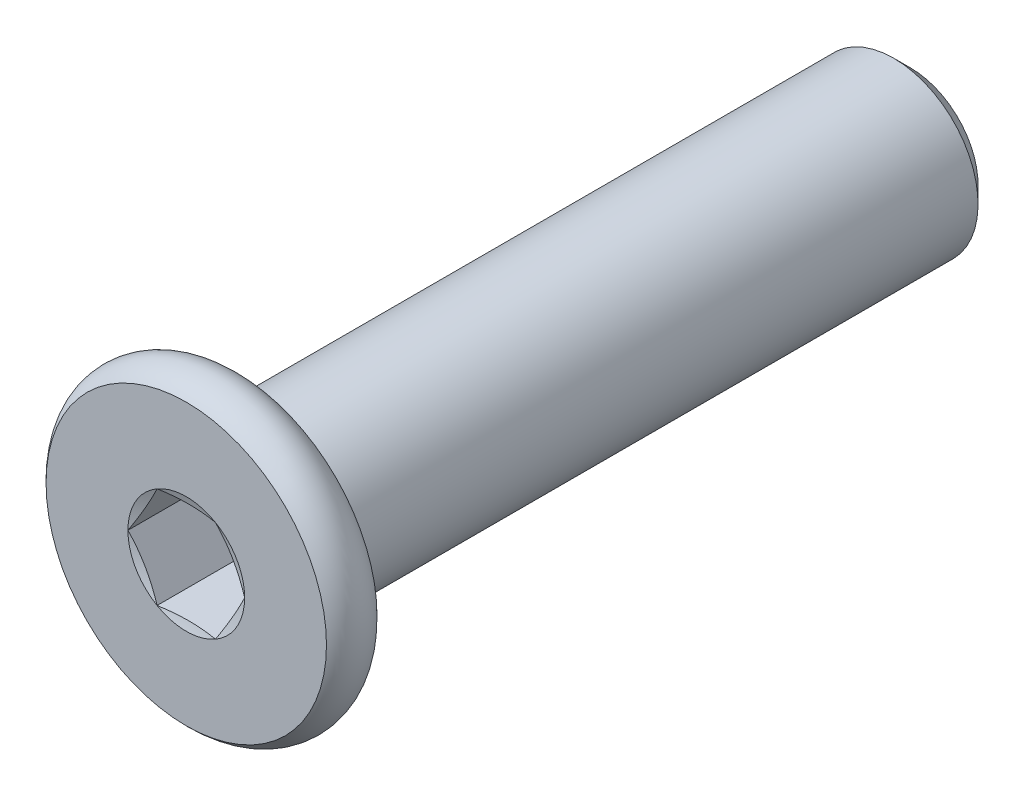
ISO-10303-21;
HEADER;
FILE_DESCRIPTION(('STEP AP214'),'2;1');
FILE_NAME('part.step','',(''),(''),'','','');
FILE_SCHEMA(('AUTOMOTIVE_DESIGN { 1 0 10303 214 1 1 1 1 }'));
ENDSEC;
DATA;
#1=APPLICATION_CONTEXT('core data for automotive mechanical design processes');
#2=APPLICATION_PROTOCOL_DEFINITION('international standard','automotive_design',2000,#1);
#3=PRODUCT_CONTEXT('',#1,'mechanical');
#4=PRODUCT('Part','Part','',(#3));
#5=PRODUCT_RELATED_PRODUCT_CATEGORY('part','',(#4));
#6=PRODUCT_DEFINITION_FORMATION('','',#4);
#7=PRODUCT_DEFINITION_CONTEXT('part definition',#1,'design');
#8=PRODUCT_DEFINITION('design','',#6,#7);
#9=PRODUCT_DEFINITION_SHAPE('','',#8);
#10=(LENGTH_UNIT() NAMED_UNIT(*) SI_UNIT(.MILLI.,.METRE.));
#11=(NAMED_UNIT(*) PLANE_ANGLE_UNIT() SI_UNIT($,.RADIAN.));
#12=(NAMED_UNIT(*) SI_UNIT($,.STERADIAN.) SOLID_ANGLE_UNIT());
#13=UNCERTAINTY_MEASURE_WITH_UNIT(LENGTH_MEASURE(1.E-05),#10,'distance_accuracy_value','');
#14=(GEOMETRIC_REPRESENTATION_CONTEXT(3) GLOBAL_UNCERTAINTY_ASSIGNED_CONTEXT((#13)) GLOBAL_UNIT_ASSIGNED_CONTEXT((#10,
#11,#12)) REPRESENTATION_CONTEXT('',''));
#15=CARTESIAN_POINT('',(0.,0.,0.));
#16=DIRECTION('',(0.,0.,1.));
#17=DIRECTION('',(1.,0.,0.));
#18=AXIS2_PLACEMENT_3D('',#15,#16,#17);
#19=CARTESIAN_POINT('',(0.,0.,19.6597066666667));
#20=DIRECTION('',(0.,0.,1.));
#21=DIRECTION('',(1.,0.,0.));
#22=AXIS2_PLACEMENT_3D('',#19,#20,#21);
#23=SPHERICAL_SURFACE('',#22,5.14970666666667);
#24=CARTESIAN_POINT('',(0.,1.49995599935464,19.6597066666667));
#25=DIRECTION('',(0.,1.,0.));
#26=DIRECTION('',(0.,0.,1.));
#27=AXIS2_PLACEMENT_3D('',#24,#25,#26);
#28=CIRCLE('',#27,4.92641966875652);
#29=CARTESIAN_POINT('',(0.866,1.49995599935464,14.81));
#30=VERTEX_POINT('',#29);
#31=CARTESIAN_POINT('',(-0.866,1.49995599935464,14.81));
#32=VERTEX_POINT('',#31);
#33=EDGE_CURVE('E142',#30,#32,#28,.T.);
#34=ORIENTED_EDGE('',*,*,#33,.F.);
#35=CARTESIAN_POINT('',(0.,0.,14.81));
#36=DIRECTION('',(0.,0.,-1.));
#37=DIRECTION('',(0.,1.,0.));
#38=AXIS2_PLACEMENT_3D('',#35,#36,#37);
#39=CIRCLE('',#38,1.732);
#40=EDGE_CURVE('E170',#32,#30,#39,.T.);
#41=ORIENTED_EDGE('',*,*,#40,.F.);
#42=EDGE_LOOP('',(#34,#41));
#43=FACE_BOUND('',#42,.T.);
#44=ADVANCED_FACE('F16',(#43),#23,.F.);
#45=CARTESIAN_POINT('',(0.,0.,19.6597066666667));
#46=DIRECTION('',(0.,0.,1.));
#47=DIRECTION('',(1.,0.,0.));
#48=AXIS2_PLACEMENT_3D('',#45,#46,#47);
#49=SPHERICAL_SURFACE('',#48,5.14970666666667);
#50=CARTESIAN_POINT('',(0.,0.,14.81));
#51=DIRECTION('',(0.,0.,-1.));
#52=DIRECTION('',(0.,1.,0.));
#53=AXIS2_PLACEMENT_3D('',#50,#51,#52);
#54=CIRCLE('',#53,1.732);
#55=CARTESIAN_POINT('',(1.732,0.,14.81));
#56=VERTEX_POINT('',#55);
#57=CARTESIAN_POINT('',(0.866,-1.49995599935465,14.81));
#58=VERTEX_POINT('',#57);
#59=EDGE_CURVE('E126',#56,#58,#54,.T.);
#60=ORIENTED_EDGE('',*,*,#59,.F.);
#61=CARTESIAN_POINT('',(1.299,-0.749977999677325,19.6597066666667));
#62=DIRECTION('',(0.866025403784439,-0.5,0.));
#63=DIRECTION('',(0.,0.,-1.));
#64=AXIS2_PLACEMENT_3D('',#61,#62,#63);
#65=CIRCLE('',#64,4.92641966875652);
#66=EDGE_CURVE('E110',#58,#56,#65,.T.);
#67=ORIENTED_EDGE('',*,*,#66,.F.);
#68=EDGE_LOOP('',(#60,#67));
#69=FACE_BOUND('',#68,.T.);
#70=ADVANCED_FACE('F223',(#69),#49,.F.);
#71=CARTESIAN_POINT('',(0.,0.,19.6597066666667));
#72=DIRECTION('',(0.,0.,1.));
#73=DIRECTION('',(1.,0.,0.));
#74=AXIS2_PLACEMENT_3D('',#71,#72,#73);
#75=SPHERICAL_SURFACE('',#74,5.14970666666667);
#76=CARTESIAN_POINT('',(0.,0.,14.81));
#77=DIRECTION('',(0.,0.,-1.));
#78=DIRECTION('',(0.,1.,0.));
#79=AXIS2_PLACEMENT_3D('',#76,#77,#78);
#80=CIRCLE('',#79,1.732);
#81=CARTESIAN_POINT('',(-0.866,-1.49995599935465,14.81));
#82=VERTEX_POINT('',#81);
#83=EDGE_CURVE('E131',#58,#82,#80,.T.);
#84=ORIENTED_EDGE('',*,*,#83,.F.);
#85=CARTESIAN_POINT('',(0.,-1.49995599935465,19.6597066666667));
#86=DIRECTION('',(0.,-1.,0.));
#87=DIRECTION('',(0.,0.,-1.));
#88=AXIS2_PLACEMENT_3D('',#85,#86,#87);
#89=CIRCLE('',#88,4.92641966875652);
#90=EDGE_CURVE('E96',#82,#58,#89,.T.);
#91=ORIENTED_EDGE('',*,*,#90,.F.);
#92=EDGE_LOOP('',(#84,#91));
#93=FACE_BOUND('',#92,.T.);
#94=ADVANCED_FACE('F219',(#93),#75,.F.);
#95=CARTESIAN_POINT('',(0.,0.,19.6597066666667));
#96=DIRECTION('',(0.,0.,1.));
#97=DIRECTION('',(1.,0.,0.));
#98=AXIS2_PLACEMENT_3D('',#95,#96,#97);
#99=SPHERICAL_SURFACE('',#98,5.14970666666667);
#100=CARTESIAN_POINT('',(0.,0.,14.81));
#101=DIRECTION('',(0.,0.,-1.));
#102=DIRECTION('',(0.,1.,0.));
#103=AXIS2_PLACEMENT_3D('',#100,#101,#102);
#104=CIRCLE('',#103,1.732);
#105=CARTESIAN_POINT('',(-1.732,0.,14.81));
#106=VERTEX_POINT('',#105);
#107=EDGE_CURVE('E162',#82,#106,#104,.T.);
#108=ORIENTED_EDGE('',*,*,#107,.F.);
#109=CARTESIAN_POINT('',(-1.299,-0.749977999677326,19.6597066666667));
#110=DIRECTION('',(-0.866025403784439,-0.5,0.));
#111=DIRECTION('',(0.,0.,-1.));
#112=AXIS2_PLACEMENT_3D('',#109,#110,#111);
#113=CIRCLE('',#112,4.92641966875652);
#114=EDGE_CURVE('E11',#106,#82,#113,.T.);
#115=ORIENTED_EDGE('',*,*,#114,.F.);
#116=EDGE_LOOP('',(#108,#115));
#117=FACE_BOUND('',#116,.T.);
#118=ADVANCED_FACE('F209',(#117),#99,.F.);
#119=CARTESIAN_POINT('',(0.,0.,19.6597066666667));
#120=DIRECTION('',(0.,0.,1.));
#121=DIRECTION('',(1.,0.,0.));
#122=AXIS2_PLACEMENT_3D('',#119,#120,#121);
#123=SPHERICAL_SURFACE('',#122,5.14970666666667);
#124=CARTESIAN_POINT('',(0.,0.,14.81));
#125=DIRECTION('',(0.,0.,-1.));
#126=DIRECTION('',(0.,1.,0.));
#127=AXIS2_PLACEMENT_3D('',#124,#125,#126);
#128=CIRCLE('',#127,1.732);
#129=EDGE_CURVE('E173',#106,#32,#128,.T.);
#130=ORIENTED_EDGE('',*,*,#129,.F.);
#131=CARTESIAN_POINT('',(-1.299,0.749977999677323,19.6597066666667));
#132=DIRECTION('',(-0.866025403784439,0.5,0.));
#133=DIRECTION('',(0.,0.,1.));
#134=AXIS2_PLACEMENT_3D('',#131,#132,#133);
#135=CIRCLE('',#134,4.92641966875652);
#136=EDGE_CURVE('E152',#32,#106,#135,.T.);
#137=ORIENTED_EDGE('',*,*,#136,.F.);
#138=EDGE_LOOP('',(#130,#137));
#139=FACE_BOUND('',#138,.T.);
#140=ADVANCED_FACE('F226',(#139),#123,.F.);
#141=CARTESIAN_POINT('',(0.,0.,19.6597066666667));
#142=DIRECTION('',(0.,0.,1.));
#143=DIRECTION('',(1.,0.,0.));
#144=AXIS2_PLACEMENT_3D('',#141,#142,#143);
#145=SPHERICAL_SURFACE('',#144,5.14970666666667);
#146=CARTESIAN_POINT('',(1.299,0.749977999677323,19.6597066666667));
#147=DIRECTION('',(0.866025403784439,0.5,0.));
#148=DIRECTION('',(0.,0.,-1.));
#149=AXIS2_PLACEMENT_3D('',#146,#147,#148);
#150=CIRCLE('',#149,4.92641966875652);
#151=EDGE_CURVE('E132',#56,#30,#150,.T.);
#152=ORIENTED_EDGE('',*,*,#151,.F.);
#153=CARTESIAN_POINT('',(0.,0.,14.81));
#154=DIRECTION('',(0.,0.,-1.));
#155=DIRECTION('',(0.,1.,0.));
#156=AXIS2_PLACEMENT_3D('',#153,#154,#155);
#157=CIRCLE('',#156,1.732);
#158=EDGE_CURVE('E33',#30,#56,#157,.T.);
#159=ORIENTED_EDGE('',*,*,#158,.F.);
#160=EDGE_LOOP('',(#152,#159));
#161=FACE_BOUND('',#160,.T.);
#162=ADVANCED_FACE('F224',(#161),#145,.F.);
#163=CARTESIAN_POINT('',(-0.866,-1.49995599935465,14.81));
#164=DIRECTION('',(-0.866025403784439,-0.5,0.));
#165=DIRECTION('',(-0.5,0.866025403784439,0.));
#166=AXIS2_PLACEMENT_3D('',#163,#164,#165);
#167=PLANE('',#166);
#168=ORIENTED_EDGE('',*,*,#114,.T.);
#169=DIRECTION('',(0.,0.,-1.));
#170=VECTOR('',#169,1.);
#171=CARTESIAN_POINT('',(-0.866,-1.49995599935465,14.81));
#172=LINE('',#171,#170);
#173=CARTESIAN_POINT('',(-0.866,-1.49995599935465,12.51));
#174=VERTEX_POINT('',#173);
#175=EDGE_CURVE('E26',#82,#174,#172,.T.);
#176=ORIENTED_EDGE('',*,*,#175,.T.);
#177=DIRECTION('',(-0.5,0.866025403784439,0.));
#178=VECTOR('',#177,1.);
#179=CARTESIAN_POINT('',(-0.866,-1.49995599935465,12.51));
#180=LINE('',#179,#178);
#181=CARTESIAN_POINT('',(-1.732,0.,12.51));
#182=VERTEX_POINT('',#181);
#183=EDGE_CURVE('E85',#174,#182,#180,.T.);
#184=ORIENTED_EDGE('',*,*,#183,.T.);
#185=DIRECTION('',(0.,0.,-1.));
#186=VECTOR('',#185,1.);
#187=CARTESIAN_POINT('',(-1.732,0.,14.81));
#188=LINE('',#187,#186);
#189=EDGE_CURVE('E159',#106,#182,#188,.T.);
#190=ORIENTED_EDGE('',*,*,#189,.F.);
#191=EDGE_LOOP('',(#168,#176,#184,#190));
#192=FACE_BOUND('',#191,.T.);
#193=ADVANCED_FACE('F99',(#192),#167,.F.);
#194=CARTESIAN_POINT('',(0.866,-1.49995599935465,14.81));
#195=DIRECTION('',(0.,-1.,0.));
#196=DIRECTION('',(-1.,0.,0.));
#197=AXIS2_PLACEMENT_3D('',#194,#195,#196);
#198=PLANE('',#197);
#199=ORIENTED_EDGE('',*,*,#90,.T.);
#200=DIRECTION('',(0.,0.,-1.));
#201=VECTOR('',#200,1.);
#202=CARTESIAN_POINT('',(0.866,-1.49995599935465,14.81));
#203=LINE('',#202,#201);
#204=CARTESIAN_POINT('',(0.866,-1.49995599935465,12.51));
#205=VERTEX_POINT('',#204);
#206=EDGE_CURVE('E107',#58,#205,#203,.T.);
#207=ORIENTED_EDGE('',*,*,#206,.T.);
#208=DIRECTION('',(-1.,0.,0.));
#209=VECTOR('',#208,1.);
#210=CARTESIAN_POINT('',(0.866,-1.49995599935465,12.51));
#211=LINE('',#210,#209);
#212=EDGE_CURVE('E89',#205,#174,#211,.T.);
#213=ORIENTED_EDGE('',*,*,#212,.T.);
#214=ORIENTED_EDGE('',*,*,#175,.F.);
#215=EDGE_LOOP('',(#199,#207,#213,#214));
#216=FACE_BOUND('',#215,.T.);
#217=ADVANCED_FACE('F105',(#216),#198,.F.);
#218=CARTESIAN_POINT('',(1.732,0.,14.81));
#219=DIRECTION('',(0.866025403784439,-0.5,0.));
#220=DIRECTION('',(-0.5,-0.866025403784439,0.));
#221=AXIS2_PLACEMENT_3D('',#218,#219,#220);
#222=PLANE('',#221);
#223=ORIENTED_EDGE('',*,*,#66,.T.);
#224=DIRECTION('',(0.,0.,-1.));
#225=VECTOR('',#224,1.);
#226=CARTESIAN_POINT('',(1.732,0.,14.81));
#227=LINE('',#226,#225);
#228=CARTESIAN_POINT('',(1.732,0.,12.51));
#229=VERTEX_POINT('',#228);
#230=EDGE_CURVE('E120',#56,#229,#227,.T.);
#231=ORIENTED_EDGE('',*,*,#230,.T.);
#232=DIRECTION('',(-0.5,-0.866025403784439,0.));
#233=VECTOR('',#232,1.);
#234=CARTESIAN_POINT('',(1.732,0.,12.51));
#235=LINE('',#234,#233);
#236=EDGE_CURVE('E136',#229,#205,#235,.T.);
#237=ORIENTED_EDGE('',*,*,#236,.T.);
#238=ORIENTED_EDGE('',*,*,#206,.F.);
#239=EDGE_LOOP('',(#223,#231,#237,#238));
#240=FACE_BOUND('',#239,.T.);
#241=ADVANCED_FACE('F221',(#240),#222,.F.);
#242=CARTESIAN_POINT('',(0.866,1.49995599935464,14.81));
#243=DIRECTION('',(0.866025403784439,0.5,0.));
#244=DIRECTION('',(0.5,-0.866025403784439,0.));
#245=AXIS2_PLACEMENT_3D('',#242,#243,#244);
#246=PLANE('',#245);
#247=ORIENTED_EDGE('',*,*,#151,.T.);
#248=DIRECTION('',(0.,0.,-1.));
#249=VECTOR('',#248,1.);
#250=CARTESIAN_POINT('',(0.866,1.49995599935464,14.81));
#251=LINE('',#250,#249);
#252=CARTESIAN_POINT('',(0.866,1.49995599935465,12.51));
#253=VERTEX_POINT('',#252);
#254=EDGE_CURVE('E137',#30,#253,#251,.T.);
#255=ORIENTED_EDGE('',*,*,#254,.T.);
#256=DIRECTION('',(0.5,-0.866025403784439,0.));
#257=VECTOR('',#256,1.);
#258=CARTESIAN_POINT('',(0.866,1.49995599935465,12.51));
#259=LINE('',#258,#257);
#260=EDGE_CURVE('E149',#253,#229,#259,.T.);
#261=ORIENTED_EDGE('',*,*,#260,.T.);
#262=ORIENTED_EDGE('',*,*,#230,.F.);
#263=EDGE_LOOP('',(#247,#255,#261,#262));
#264=FACE_BOUND('',#263,.T.);
#265=ADVANCED_FACE('F18',(#264),#246,.F.);
#266=CARTESIAN_POINT('',(-0.866,1.49995599935464,14.81));
#267=DIRECTION('',(0.,1.,0.));
#268=DIRECTION('',(1.,0.,0.));
#269=AXIS2_PLACEMENT_3D('',#266,#267,#268);
#270=PLANE('',#269);
#271=ORIENTED_EDGE('',*,*,#33,.T.);
#272=DIRECTION('',(0.,0.,-1.));
#273=VECTOR('',#272,1.);
#274=CARTESIAN_POINT('',(-0.866,1.49995599935464,14.81));
#275=LINE('',#274,#273);
#276=CARTESIAN_POINT('',(-0.866,1.49995599935464,12.51));
#277=VERTEX_POINT('',#276);
#278=EDGE_CURVE('E140',#32,#277,#275,.T.);
#279=ORIENTED_EDGE('',*,*,#278,.T.);
#280=DIRECTION('',(1.,0.,0.));
#281=VECTOR('',#280,1.);
#282=CARTESIAN_POINT('',(-0.866,1.49995599935464,12.51));
#283=LINE('',#282,#281);
#284=EDGE_CURVE('E71',#277,#253,#283,.T.);
#285=ORIENTED_EDGE('',*,*,#284,.T.);
#286=ORIENTED_EDGE('',*,*,#254,.F.);
#287=EDGE_LOOP('',(#271,#279,#285,#286));
#288=FACE_BOUND('',#287,.T.);
#289=ADVANCED_FACE('F202',(#288),#270,.F.);
#290=CARTESIAN_POINT('',(-1.732,0.,14.81));
#291=DIRECTION('',(-0.866025403784439,0.5,0.));
#292=DIRECTION('',(0.5,0.866025403784439,0.));
#293=AXIS2_PLACEMENT_3D('',#290,#291,#292);
#294=PLANE('',#293);
#295=ORIENTED_EDGE('',*,*,#136,.T.);
#296=ORIENTED_EDGE('',*,*,#189,.T.);
#297=DIRECTION('',(0.5,0.866025403784439,0.));
#298=VECTOR('',#297,1.);
#299=CARTESIAN_POINT('',(-1.732,0.,12.51));
#300=LINE('',#299,#298);
#301=EDGE_CURVE('E92',#182,#277,#300,.T.);
#302=ORIENTED_EDGE('',*,*,#301,.T.);
#303=ORIENTED_EDGE('',*,*,#278,.F.);
#304=EDGE_LOOP('',(#295,#296,#302,#303));
#305=FACE_BOUND('',#304,.T.);
#306=ADVANCED_FACE('F205',(#305),#294,.F.);
#307=CARTESIAN_POINT('',(0.,0.,12.51));
#308=DIRECTION('',(0.,0.,-1.));
#309=DIRECTION('',(-1.,0.,0.));
#310=AXIS2_PLACEMENT_3D('',#307,#308,#309);
#311=PLANE('',#310);
#312=ORIENTED_EDGE('',*,*,#236,.F.);
#313=ORIENTED_EDGE('',*,*,#260,.F.);
#314=ORIENTED_EDGE('',*,*,#284,.F.);
#315=ORIENTED_EDGE('',*,*,#301,.F.);
#316=ORIENTED_EDGE('',*,*,#183,.F.);
#317=ORIENTED_EDGE('',*,*,#212,.F.);
#318=EDGE_LOOP('',(#312,#313,#314,#315,#316,#317));
#319=FACE_BOUND('',#318,.T.);
#320=ADVANCED_FACE('F87',(#319),#311,.F.);
#321=CARTESIAN_POINT('',(0.,0.,-1.6900000000002));
#322=DIRECTION('',(0.,0.,1.));
#323=DIRECTION('',(0.,1.,0.));
#324=AXIS2_PLACEMENT_3D('',#321,#322,#323);
#325=CYLINDRICAL_SURFACE('',#324,2.5000000000022);
#326=CARTESIAN_POINT('',(0.,0.,13.31));
#327=DIRECTION('',(0.,0.,-1.));
#328=DIRECTION('',(1.,0.,0.));
#329=AXIS2_PLACEMENT_3D('',#326,#327,#328);
#330=CIRCLE('',#329,2.5);
#331=CARTESIAN_POINT('',(0.,2.5,13.31));
#332=VERTEX_POINT('',#331);
#333=EDGE_CURVE('E66',#332,#332,#330,.T.);
#334=ORIENTED_EDGE('',*,*,#333,.T.);
#335=EDGE_LOOP('',(#334));
#336=FACE_BOUND('',#335,.T.);
#337=CARTESIAN_POINT('',(0.,0.,-6.19000000000039));
#338=DIRECTION('',(0.,0.,-1.));
#339=DIRECTION('',(1.,0.,0.));
#340=AXIS2_PLACEMENT_3D('',#337,#338,#339);
#341=CIRCLE('',#340,2.50000000000286);
#342=CARTESIAN_POINT('',(0.,2.5000000000029,-6.19000000000039));
#343=VERTEX_POINT('',#342);
#344=EDGE_CURVE('E139',#343,#343,#341,.T.);
#345=ORIENTED_EDGE('',*,*,#344,.F.);
#346=EDGE_LOOP('',(#345));
#347=FACE_BOUND('',#346,.T.);
#348=ADVANCED_FACE('F275',(#336,#347),#325,.T.);
#349=CARTESIAN_POINT('',(0.,0.,-6.44000000000038));
#350=DIRECTION('',(0.,0.,1.));
#351=DIRECTION('',(0.,1.,0.));
#352=AXIS2_PLACEMENT_3D('',#349,#350,#351);
#353=CONICAL_SURFACE('',#352,2.2500000000029,0.785398163397397);
#354=ORIENTED_EDGE('',*,*,#344,.T.);
#355=EDGE_LOOP('',(#354));
#356=FACE_BOUND('',#355,.T.);
#357=CARTESIAN_POINT('',(0.,0.,-6.69000000000037));
#358=DIRECTION('',(0.,0.,-1.));
#359=DIRECTION('',(1.,0.,0.));
#360=AXIS2_PLACEMENT_3D('',#357,#358,#359);
#361=CIRCLE('',#360,2.00000000000294);
#362=CARTESIAN_POINT('',(0.,2.00000000000298,-6.69000000000037));
#363=VERTEX_POINT('',#362);
#364=EDGE_CURVE('E130',#363,#363,#361,.T.);
#365=ORIENTED_EDGE('',*,*,#364,.F.);
#366=EDGE_LOOP('',(#365));
#367=FACE_BOUND('',#366,.T.);
#368=ADVANCED_FACE('F262',(#356,#367),#353,.T.);
#369=CARTESIAN_POINT('',(0.,0.,-6.69000000000028));
#370=DIRECTION('',(0.,0.,-1.));
#371=DIRECTION('',(-1.,0.,0.));
#372=AXIS2_PLACEMENT_3D('',#369,#370,#371);
#373=PLANE('',#372);
#374=ORIENTED_EDGE('',*,*,#364,.T.);
#375=EDGE_LOOP('',(#374));
#376=FACE_BOUND('',#375,.T.);
#377=ADVANCED_FACE('F258',(#376),#373,.T.);
#378=CARTESIAN_POINT('',(0.,4.16143782776616,14.81));
#379=DIRECTION('',(0.,0.,1.));
#380=DIRECTION('',(1.,0.,0.));
#381=AXIS2_PLACEMENT_3D('',#378,#379,#380);
#382=PLANE('',#381);
#383=ORIENTED_EDGE('',*,*,#59,.T.);
#384=ORIENTED_EDGE('',*,*,#83,.T.);
#385=ORIENTED_EDGE('',*,*,#107,.T.);
#386=ORIENTED_EDGE('',*,*,#129,.T.);
#387=ORIENTED_EDGE('',*,*,#40,.T.);
#388=ORIENTED_EDGE('',*,*,#158,.T.);
#389=EDGE_LOOP('',(#383,#384,#385,#386,#387,#388));
#390=FACE_BOUND('',#389,.T.);
#391=CARTESIAN_POINT('',(0.,0.,14.81));
#392=DIRECTION('',(0.,0.,-1.));
#393=DIRECTION('',(1.,0.,0.));
#394=AXIS2_PLACEMENT_3D('',#391,#392,#393);
#395=CIRCLE('',#394,4.16143782776613);
#396=CARTESIAN_POINT('',(0.,4.16143782776616,14.81));
#397=VERTEX_POINT('',#396);
#398=EDGE_CURVE('E124',#397,#397,#395,.T.);
#399=ORIENTED_EDGE('',*,*,#398,.F.);
#400=EDGE_LOOP('',(#399));
#401=FACE_BOUND('',#400,.T.);
#402=ADVANCED_FACE('F214',(#390,#401),#382,.T.);
#403=CARTESIAN_POINT('',(0.,0.,14.0600000000004));
#404=DIRECTION('',(0.,0.,-1.));
#405=DIRECTION('',(-1.,0.,0.));
#406=AXIS2_PLACEMENT_3D('',#403,#404,#405);
#407=TOROIDAL_SURFACE('',#406,3.49999999999993,1.);
#408=ORIENTED_EDGE('',*,*,#398,.T.);
#409=EDGE_LOOP('',(#408));
#410=FACE_BOUND('',#409,.T.);
#411=CARTESIAN_POINT('',(0.,0.,13.31));
#412=DIRECTION('',(0.,0.,-1.));
#413=DIRECTION('',(1.,0.,0.));
#414=AXIS2_PLACEMENT_3D('',#411,#412,#413);
#415=CIRCLE('',#414,4.16143782776613);
#416=CARTESIAN_POINT('',(0.,4.16143782776616,13.31));
#417=VERTEX_POINT('',#416);
#418=EDGE_CURVE('E185',#417,#417,#415,.T.);
#419=ORIENTED_EDGE('',*,*,#418,.F.);
#420=EDGE_LOOP('',(#419));
#421=FACE_BOUND('',#420,.T.);
#422=ADVANCED_FACE('F244',(#410,#421),#407,.T.);
#423=CARTESIAN_POINT('',(0.,2.5,13.31));
#424=DIRECTION('',(0.,0.,-1.));
#425=DIRECTION('',(-1.,0.,0.));
#426=AXIS2_PLACEMENT_3D('',#423,#424,#425);
#427=PLANE('',#426);
#428=ORIENTED_EDGE('',*,*,#418,.T.);
#429=EDGE_LOOP('',(#428));
#430=FACE_BOUND('',#429,.T.);
#431=ORIENTED_EDGE('',*,*,#333,.F.);
#432=EDGE_LOOP('',(#431));
#433=FACE_BOUND('',#432,.T.);
#434=ADVANCED_FACE('F242',(#430,#433),#427,.T.);
#435=CLOSED_SHELL('',(#44,#70,#94,#118,#140,#162,#193,#217,#241,#265,#289,#306,#320,#348,#368,
#377,#402,#422,#434));
#436=MANIFOLD_SOLID_BREP('B1',#435);
#437=ADVANCED_BREP_SHAPE_REPRESENTATION('',(#18,#436),#14);
#438=SHAPE_DEFINITION_REPRESENTATION(#9,#437);
ENDSEC;
END-ISO-10303-21;
